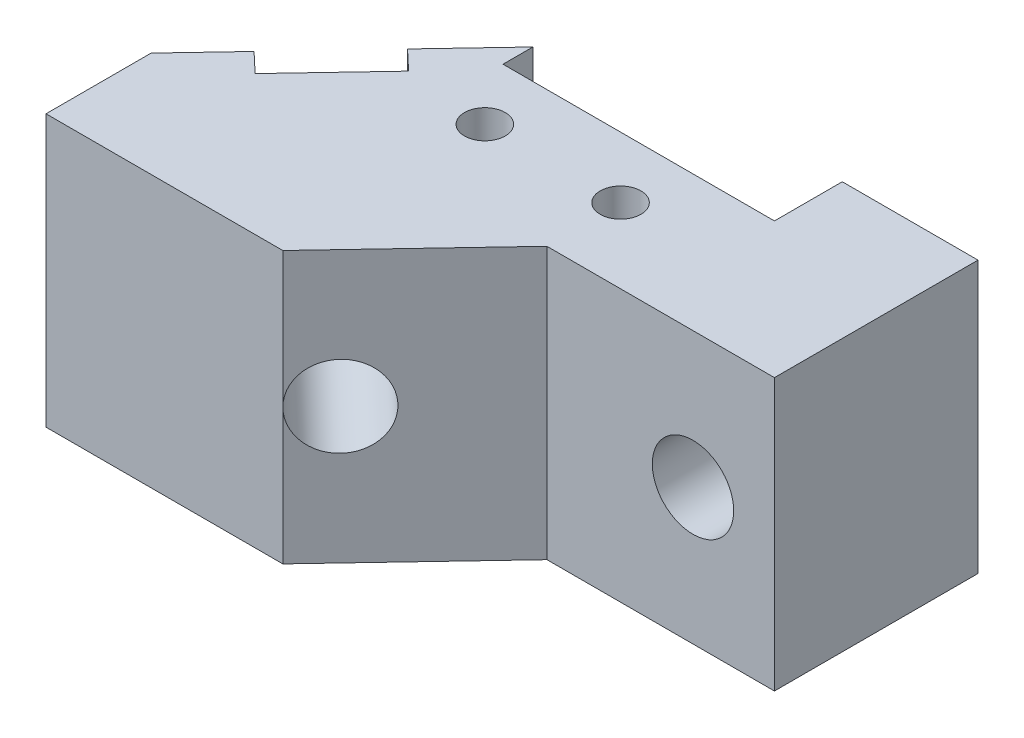
ISO-10303-21;
HEADER;
FILE_DESCRIPTION(('STEP AP214'),'2;1');
FILE_NAME('part.step','',(''),(''),'','','');
FILE_SCHEMA(('AUTOMOTIVE_DESIGN { 1 0 10303 214 1 1 1 1 }'));
ENDSEC;
DATA;
#1=APPLICATION_CONTEXT('core data for automotive mechanical design processes');
#2=APPLICATION_PROTOCOL_DEFINITION('international standard','automotive_design',2000,#1);
#3=PRODUCT_CONTEXT('',#1,'mechanical');
#4=PRODUCT('Part','Part','',(#3));
#5=PRODUCT_RELATED_PRODUCT_CATEGORY('part','',(#4));
#6=PRODUCT_DEFINITION_FORMATION('','',#4);
#7=PRODUCT_DEFINITION_CONTEXT('part definition',#1,'design');
#8=PRODUCT_DEFINITION('design','',#6,#7);
#9=PRODUCT_DEFINITION_SHAPE('','',#8);
#10=(LENGTH_UNIT() NAMED_UNIT(*) SI_UNIT(.MILLI.,.METRE.));
#11=(NAMED_UNIT(*) PLANE_ANGLE_UNIT() SI_UNIT($,.RADIAN.));
#12=(NAMED_UNIT(*) SI_UNIT($,.STERADIAN.) SOLID_ANGLE_UNIT());
#13=UNCERTAINTY_MEASURE_WITH_UNIT(LENGTH_MEASURE(1.E-05),#10,'distance_accuracy_value','');
#14=(GEOMETRIC_REPRESENTATION_CONTEXT(3) GLOBAL_UNCERTAINTY_ASSIGNED_CONTEXT((#13)) GLOBAL_UNIT_ASSIGNED_CONTEXT((#10,
#11,#12)) REPRESENTATION_CONTEXT('',''));
#15=CARTESIAN_POINT('',(0.,0.,0.));
#16=DIRECTION('',(0.,0.,1.));
#17=DIRECTION('',(1.,0.,0.));
#18=AXIS2_PLACEMENT_3D('',#15,#16,#17);
#19=CARTESIAN_POINT('',(-37.6748986965471,20.,-40.));
#20=DIRECTION('',(0.,0.,1.));
#21=DIRECTION('',(1.,0.,0.));
#22=AXIS2_PLACEMENT_3D('',#19,#20,#21);
#23=PLANE('',#22);
#24=CARTESIAN_POINT('',(0.,10.,-40.));
#25=DIRECTION('',(0.,0.,-1.));
#26=DIRECTION('',(-1.,0.,0.));
#27=AXIS2_PLACEMENT_3D('',#24,#25,#26);
#28=CIRCLE('',#27,3.);
#29=CARTESIAN_POINT('',(-3.,10.,-40.));
#30=VERTEX_POINT('',#29);
#31=EDGE_CURVE('E232',#30,#30,#28,.T.);
#32=ORIENTED_EDGE('',*,*,#31,.F.);
#33=EDGE_LOOP('',(#32));
#34=FACE_BOUND('',#33,.T.);
#35=DIRECTION('',(0.,1.,0.));
#36=VECTOR('',#35,1.);
#37=CARTESIAN_POINT('',(-4.,0.,-40.));
#38=LINE('',#37,#36);
#39=CARTESIAN_POINT('',(-4.,0.,-40.));
#40=VERTEX_POINT('',#39);
#41=CARTESIAN_POINT('',(-4.,20.,-40.));
#42=VERTEX_POINT('',#41);
#43=EDGE_CURVE('E408',#40,#42,#38,.T.);
#44=ORIENTED_EDGE('',*,*,#43,.T.);
#45=DIRECTION('',(-1.,0.,0.));
#46=VECTOR('',#45,1.);
#47=CARTESIAN_POINT('',(-37.6748986965471,20.,-40.));
#48=LINE('',#47,#46);
#49=CARTESIAN_POINT('',(6.,20.,-40.));
#50=VERTEX_POINT('',#49);
#51=EDGE_CURVE('E235',#50,#42,#48,.T.);
#52=ORIENTED_EDGE('',*,*,#51,.F.);
#53=DIRECTION('',(0.,-1.,0.));
#54=VECTOR('',#53,1.);
#55=CARTESIAN_POINT('',(6.,20.,-40.));
#56=LINE('',#55,#54);
#57=CARTESIAN_POINT('',(6.,0.,-40.));
#58=VERTEX_POINT('',#57);
#59=EDGE_CURVE('E246',#50,#58,#56,.T.);
#60=ORIENTED_EDGE('',*,*,#59,.T.);
#61=DIRECTION('',(-1.,0.,0.));
#62=VECTOR('',#61,1.);
#63=CARTESIAN_POINT('',(-37.6748986965471,0.,-40.));
#64=LINE('',#63,#62);
#65=EDGE_CURVE('E243',#58,#40,#64,.T.);
#66=ORIENTED_EDGE('',*,*,#65,.T.);
#67=EDGE_LOOP('',(#44,#52,#60,#66));
#68=FACE_BOUND('',#67,.T.);
#69=ADVANCED_FACE('F36',(#34,#68),#23,.F.);
#70=CARTESIAN_POINT('',(0.,20.,0.));
#71=DIRECTION('',(0.,1.,0.));
#72=DIRECTION('',(0.,0.,1.));
#73=AXIS2_PLACEMENT_3D('',#70,#71,#72);
#74=PLANE('',#73);
#75=CARTESIAN_POINT('',(-20.8374493482735,20.,-30.5));
#76=DIRECTION('',(0.,1.,0.));
#77=DIRECTION('',(0.,0.,-1.));
#78=AXIS2_PLACEMENT_3D('',#75,#76,#77);
#79=CIRCLE('',#78,1.5);
#80=CARTESIAN_POINT('',(-20.8374493482735,20.,-32.));
#81=VERTEX_POINT('',#80);
#82=EDGE_CURVE('E325',#81,#81,#79,.T.);
#83=ORIENTED_EDGE('',*,*,#82,.F.);
#84=EDGE_LOOP('',(#83));
#85=FACE_BOUND('',#84,.T.);
#86=CARTESIAN_POINT('',(-10.8374493482735,20.,-30.5));
#87=DIRECTION('',(0.,1.,0.));
#88=DIRECTION('',(0.,0.,1.));
#89=AXIS2_PLACEMENT_3D('',#86,#87,#88);
#90=CIRCLE('',#89,1.5);
#91=CARTESIAN_POINT('',(-10.8374493482735,20.,-29.));
#92=VERTEX_POINT('',#91);
#93=EDGE_CURVE('E318',#92,#92,#90,.T.);
#94=ORIENTED_EDGE('',*,*,#93,.F.);
#95=EDGE_LOOP('',(#94));
#96=FACE_BOUND('',#95,.T.);
#97=DIRECTION('',(0.687178620265699,0.,-0.726488502214405));
#98=VECTOR('',#97,1.);
#99=CARTESIAN_POINT('',(-24.,20.,-37.2017917800907));
#100=LINE('',#99,#98);
#101=CARTESIAN_POINT('',(-37.6748986965471,20.,-22.7446239069881));
#102=VERTEX_POINT('',#101);
#103=CARTESIAN_POINT('',(-33.9877200762813,20.,-26.6427266625688));
#104=VERTEX_POINT('',#103);
#105=EDGE_CURVE('E51',#102,#104,#100,.T.);
#106=ORIENTED_EDGE('',*,*,#105,.F.);
#107=DIRECTION('',(0.,0.,1.));
#108=VECTOR('',#107,1.);
#109=CARTESIAN_POINT('',(-37.6748986965471,20.,-40.));
#110=LINE('',#109,#108);
#111=CARTESIAN_POINT('',(-37.674898696547,20.,-15.));
#112=VERTEX_POINT('',#111);
#113=EDGE_CURVE('E219',#102,#112,#110,.T.);
#114=ORIENTED_EDGE('',*,*,#113,.T.);
#115=DIRECTION('',(1.,0.,0.));
#116=VECTOR('',#115,1.);
#117=CARTESIAN_POINT('',(-37.674898696547,20.,-15.));
#118=LINE('',#117,#116);
#119=CARTESIAN_POINT('',(-20.2237484161567,20.,-15.));
#120=VERTEX_POINT('',#119);
#121=EDGE_CURVE('E392',#112,#120,#118,.T.);
#122=ORIENTED_EDGE('',*,*,#121,.T.);
#123=DIRECTION('',(0.687178620265726,0.,-0.72648850221438));
#124=VECTOR('',#123,1.);
#125=CARTESIAN_POINT('',(-10.7648427600979,20.,-25.));
#126=LINE('',#125,#124);
#127=CARTESIAN_POINT('',(-10.7648427600979,20.,-25.));
#128=VERTEX_POINT('',#127);
#129=EDGE_CURVE('E394',#120,#128,#126,.T.);
#130=ORIENTED_EDGE('',*,*,#129,.T.);
#131=DIRECTION('',(1.,0.,0.));
#132=VECTOR('',#131,1.);
#133=CARTESIAN_POINT('',(6.,20.,-25.));
#134=LINE('',#133,#132);
#135=CARTESIAN_POINT('',(6.,20.,-25.));
#136=VERTEX_POINT('',#135);
#137=EDGE_CURVE('E396',#128,#136,#134,.T.);
#138=ORIENTED_EDGE('',*,*,#137,.T.);
#139=DIRECTION('',(0.,0.,-1.));
#140=VECTOR('',#139,1.);
#141=CARTESIAN_POINT('',(6.,20.,-40.));
#142=LINE('',#141,#140);
#143=EDGE_CURVE('E397',#136,#50,#142,.T.);
#144=ORIENTED_EDGE('',*,*,#143,.T.);
#145=ORIENTED_EDGE('',*,*,#51,.T.);
#146=DIRECTION('',(0.,0.,-1.));
#147=VECTOR('',#146,1.);
#148=CARTESIAN_POINT('',(-4.,20.,-35.));
#149=LINE('',#148,#147);
#150=CARTESIAN_POINT('',(-4.,20.,-35.));
#151=VERTEX_POINT('',#150);
#152=EDGE_CURVE('E404',#151,#42,#149,.T.);
#153=ORIENTED_EDGE('',*,*,#152,.F.);
#154=DIRECTION('',(1.,0.,0.));
#155=VECTOR('',#154,1.);
#156=CARTESIAN_POINT('',(0.,20.,-35.));
#157=LINE('',#156,#155);
#158=CARTESIAN_POINT('',(-24.,20.,-35.));
#159=VERTEX_POINT('',#158);
#160=EDGE_CURVE('E763',#159,#151,#157,.T.);
#161=ORIENTED_EDGE('',*,*,#160,.F.);
#162=DIRECTION('',(0.,0.,-1.));
#163=VECTOR('',#162,1.);
#164=CARTESIAN_POINT('',(-24.,20.,-35.));
#165=LINE('',#164,#163);
#166=CARTESIAN_POINT('',(-24.,20.,-37.2017917800907));
#167=VERTEX_POINT('',#166);
#168=EDGE_CURVE('E431',#159,#167,#165,.T.);
#169=ORIENTED_EDGE('',*,*,#168,.T.);
#170=CARTESIAN_POINT('',(-28.4902911141557,20.,-32.454634680284));
#171=VERTEX_POINT('',#170);
#172=EDGE_CURVE('E59',#171,#167,#100,.T.);
#173=ORIENTED_EDGE('',*,*,#172,.F.);
#174=DIRECTION('',(0.726488502214379,0.,0.687178620265727));
#175=VECTOR('',#174,1.);
#176=CARTESIAN_POINT('',(-37.1046470805999,20.,-40.6028727177143));
#177=LINE('',#176,#175);
#178=CARTESIAN_POINT('',(-27.0373141097267,20.,-31.0802774397523));
#179=VERTEX_POINT('',#178);
#180=EDGE_CURVE('E353',#171,#179,#177,.T.);
#181=ORIENTED_EDGE('',*,*,#180,.T.);
#182=DIRECTION('',(0.687178620265725,0.,-0.726488502214381));
#183=VECTOR('',#182,1.);
#184=CARTESIAN_POINT('',(-27.0373141097267,20.,-31.0802774397523));
#185=LINE('',#184,#183);
#186=CARTESIAN_POINT('',(-32.5347430718525,20.,-25.2683694220373));
#187=VERTEX_POINT('',#186);
#188=EDGE_CURVE('E351',#187,#179,#185,.T.);
#189=ORIENTED_EDGE('',*,*,#188,.F.);
#190=DIRECTION('',(0.726488502214379,0.,0.687178620265727));
#191=VECTOR('',#190,1.);
#192=CARTESIAN_POINT('',(-42.6020760427257,20.,-34.7909646999993));
#193=LINE('',#192,#191);
#194=EDGE_CURVE('E349',#104,#187,#193,.T.);
#195=ORIENTED_EDGE('',*,*,#194,.F.);
#196=EDGE_LOOP('',(#106,#114,#122,#130,#138,#144,#145,#153,#161,#169,#173,#181,#189,#195));
#197=FACE_BOUND('',#196,.T.);
#198=ADVANCED_FACE('F340',(#85,#96,#197),#74,.T.);
#199=CARTESIAN_POINT('',(-36.4174684603342,5.,-41.3293612199287));
#200=DIRECTION('',(0.687178620265726,0.,-0.726488502214379));
#201=DIRECTION('',(-0.72648850221438,0.,-0.687178620265727));
#202=AXIS2_PLACEMENT_3D('',#199,#200,#201);
#203=PLANE('',#202);
#204=DIRECTION('',(0.726488502214379,0.,0.687178620265726));
#205=VECTOR('',#204,1.);
#206=CARTESIAN_POINT('',(-36.4174684603342,15.,-41.3293612199287));
#207=LINE('',#206,#205);
#208=CARTESIAN_POINT('',(-27.80311249389,15.,-33.1811231824984));
#209=VERTEX_POINT('',#208);
#210=CARTESIAN_POINT('',(-24.1706699828178,15.,-29.7452300811695));
#211=VERTEX_POINT('',#210);
#212=EDGE_CURVE('E383',#209,#211,#207,.T.);
#213=ORIENTED_EDGE('',*,*,#212,.F.);
#214=DIRECTION('',(0.,-1.,0.));
#215=VECTOR('',#214,1.);
#216=CARTESIAN_POINT('',(-27.80311249389,5.,-33.1811231824985));
#217=LINE('',#216,#215);
#218=CARTESIAN_POINT('',(-27.80311249389,5.,-33.1811231824985));
#219=VERTEX_POINT('',#218);
#220=EDGE_CURVE('E301',#209,#219,#217,.T.);
#221=ORIENTED_EDGE('',*,*,#220,.T.);
#222=DIRECTION('',(0.726488502214379,0.,0.687178620265726));
#223=VECTOR('',#222,1.);
#224=CARTESIAN_POINT('',(-36.4174684603342,5.,-41.3293612199287));
#225=LINE('',#224,#223);
#226=CARTESIAN_POINT('',(-24.1706699828178,5.,-29.7452300811695));
#227=VERTEX_POINT('',#226);
#228=EDGE_CURVE('E385',#219,#227,#225,.T.);
#229=ORIENTED_EDGE('',*,*,#228,.T.);
#230=DIRECTION('',(0.,1.,0.));
#231=VECTOR('',#230,1.);
#232=CARTESIAN_POINT('',(-24.1706699828178,5.,-29.7452300811695));
#233=LINE('',#232,#231);
#234=EDGE_CURVE('E375',#227,#211,#233,.T.);
#235=ORIENTED_EDGE('',*,*,#234,.T.);
#236=EDGE_LOOP('',(#213,#221,#229,#235));
#237=FACE_BOUND('',#236,.T.);
#238=ADVANCED_FACE('F343',(#237),#203,.F.);
#239=CARTESIAN_POINT('',(-37.6748986965471,20.,-40.));
#240=DIRECTION('',(1.,0.,0.));
#241=DIRECTION('',(0.,0.,-1.));
#242=AXIS2_PLACEMENT_3D('',#239,#240,#241);
#243=PLANE('',#242);
#244=ORIENTED_EDGE('',*,*,#113,.F.);
#245=DIRECTION('',(0.,1.,0.));
#246=VECTOR('',#245,1.);
#247=CARTESIAN_POINT('',(-37.6748986965471,0.,-22.7446239069881));
#248=LINE('',#247,#246);
#249=CARTESIAN_POINT('',(-37.6748986965471,0.,-22.7446239069881));
#250=VERTEX_POINT('',#249);
#251=EDGE_CURVE('E206',#250,#102,#248,.T.);
#252=ORIENTED_EDGE('',*,*,#251,.F.);
#253=DIRECTION('',(0.,0.,1.));
#254=VECTOR('',#253,1.);
#255=CARTESIAN_POINT('',(-37.6748986965471,0.,-40.));
#256=LINE('',#255,#254);
#257=CARTESIAN_POINT('',(-37.674898696547,0.,-15.));
#258=VERTEX_POINT('',#257);
#259=EDGE_CURVE('E217',#250,#258,#256,.T.);
#260=ORIENTED_EDGE('',*,*,#259,.T.);
#261=DIRECTION('',(0.,-1.,0.));
#262=VECTOR('',#261,1.);
#263=CARTESIAN_POINT('',(-37.674898696547,20.,-15.));
#264=LINE('',#263,#262);
#265=EDGE_CURVE('E259',#112,#258,#264,.T.);
#266=ORIENTED_EDGE('',*,*,#265,.F.);
#267=EDGE_LOOP('',(#244,#252,#260,#266));
#268=FACE_BOUND('',#267,.T.);
#269=ADVANCED_FACE('F38',(#268),#243,.F.);
#270=CARTESIAN_POINT('',(0.,0.,0.));
#271=DIRECTION('',(0.,1.,0.));
#272=DIRECTION('',(0.,0.,1.));
#273=AXIS2_PLACEMENT_3D('',#270,#271,#272);
#274=PLANE('',#273);
#275=CARTESIAN_POINT('',(-20.8374493482735,0.,-30.5));
#276=DIRECTION('',(0.,1.,0.));
#277=DIRECTION('',(0.,0.,-1.));
#278=AXIS2_PLACEMENT_3D('',#275,#276,#277);
#279=CIRCLE('',#278,1.5);
#280=CARTESIAN_POINT('',(-20.8374493482735,0.,-32.));
#281=VERTEX_POINT('',#280);
#282=EDGE_CURVE('E322',#281,#281,#279,.T.);
#283=ORIENTED_EDGE('',*,*,#282,.T.);
#284=EDGE_LOOP('',(#283));
#285=FACE_BOUND('',#284,.T.);
#286=CARTESIAN_POINT('',(-10.8374493482735,0.,-30.5));
#287=DIRECTION('',(0.,1.,0.));
#288=DIRECTION('',(0.,0.,1.));
#289=AXIS2_PLACEMENT_3D('',#286,#287,#288);
#290=CIRCLE('',#289,1.5);
#291=CARTESIAN_POINT('',(-10.8374493482735,0.,-29.));
#292=VERTEX_POINT('',#291);
#293=EDGE_CURVE('E321',#292,#292,#290,.T.);
#294=ORIENTED_EDGE('',*,*,#293,.T.);
#295=EDGE_LOOP('',(#294));
#296=FACE_BOUND('',#295,.T.);
#297=ORIENTED_EDGE('',*,*,#259,.F.);
#298=DIRECTION('',(0.687178620265699,0.,-0.726488502214405));
#299=VECTOR('',#298,1.);
#300=CARTESIAN_POINT('',(-24.,0.,-37.2017917800907));
#301=LINE('',#300,#299);
#302=CARTESIAN_POINT('',(-33.9877200762813,0.,-26.6427266625688));
#303=VERTEX_POINT('',#302);
#304=EDGE_CURVE('E203',#250,#303,#301,.T.);
#305=ORIENTED_EDGE('',*,*,#304,.T.);
#306=DIRECTION('',(0.726488502214379,0.,0.687178620265727));
#307=VECTOR('',#306,1.);
#308=CARTESIAN_POINT('',(-42.6020760427257,0.,-34.7909646999993));
#309=LINE('',#308,#307);
#310=CARTESIAN_POINT('',(-32.5347430718525,0.,-25.2683694220373));
#311=VERTEX_POINT('',#310);
#312=EDGE_CURVE('E352',#303,#311,#309,.T.);
#313=ORIENTED_EDGE('',*,*,#312,.T.);
#314=DIRECTION('',(-0.687178620265727,0.,0.726488502214379));
#315=VECTOR('',#314,1.);
#316=CARTESIAN_POINT('',(-27.6075657256738,0.,-30.477404722038));
#317=LINE('',#316,#315);
#318=CARTESIAN_POINT('',(-27.0373141097267,0.,-31.0802774397523));
#319=VERTEX_POINT('',#318);
#320=EDGE_CURVE('E439',#319,#311,#317,.T.);
#321=ORIENTED_EDGE('',*,*,#320,.F.);
#322=DIRECTION('',(0.726488502214379,0.,0.687178620265727));
#323=VECTOR('',#322,1.);
#324=CARTESIAN_POINT('',(-37.1046470805999,0.,-40.6028727177143));
#325=LINE('',#324,#323);
#326=CARTESIAN_POINT('',(-28.4902911141557,0.,-32.454634680284));
#327=VERTEX_POINT('',#326);
#328=EDGE_CURVE('E355',#327,#319,#325,.T.);
#329=ORIENTED_EDGE('',*,*,#328,.F.);
#330=CARTESIAN_POINT('',(-24.,0.,-37.2017917800907));
#331=VERTEX_POINT('',#330);
#332=EDGE_CURVE('E212',#327,#331,#301,.T.);
#333=ORIENTED_EDGE('',*,*,#332,.T.);
#334=DIRECTION('',(0.,0.,-1.));
#335=VECTOR('',#334,1.);
#336=CARTESIAN_POINT('',(-24.,0.,-35.));
#337=LINE('',#336,#335);
#338=CARTESIAN_POINT('',(-24.,0.,-35.));
#339=VERTEX_POINT('',#338);
#340=EDGE_CURVE('E425',#339,#331,#337,.T.);
#341=ORIENTED_EDGE('',*,*,#340,.F.);
#342=DIRECTION('',(-1.,0.,0.));
#343=VECTOR('',#342,1.);
#344=CARTESIAN_POINT('',(0.,0.,-35.));
#345=LINE('',#344,#343);
#346=CARTESIAN_POINT('',(-4.,0.,-35.));
#347=VERTEX_POINT('',#346);
#348=EDGE_CURVE('E757',#347,#339,#345,.T.);
#349=ORIENTED_EDGE('',*,*,#348,.F.);
#350=DIRECTION('',(0.,0.,-1.));
#351=VECTOR('',#350,1.);
#352=CARTESIAN_POINT('',(-4.,0.,-35.));
#353=LINE('',#352,#351);
#354=EDGE_CURVE('E428',#347,#40,#353,.T.);
#355=ORIENTED_EDGE('',*,*,#354,.T.);
#356=ORIENTED_EDGE('',*,*,#65,.F.);
#357=DIRECTION('',(0.,0.,-1.));
#358=VECTOR('',#357,1.);
#359=CARTESIAN_POINT('',(6.,0.,-40.));
#360=LINE('',#359,#358);
#361=CARTESIAN_POINT('',(6.,0.,-25.));
#362=VERTEX_POINT('',#361);
#363=EDGE_CURVE('E241',#362,#58,#360,.T.);
#364=ORIENTED_EDGE('',*,*,#363,.F.);
#365=DIRECTION('',(1.,0.,0.));
#366=VECTOR('',#365,1.);
#367=CARTESIAN_POINT('',(6.,0.,-25.));
#368=LINE('',#367,#366);
#369=CARTESIAN_POINT('',(-10.7648427600979,0.,-25.));
#370=VERTEX_POINT('',#369);
#371=EDGE_CURVE('E239',#370,#362,#368,.T.);
#372=ORIENTED_EDGE('',*,*,#371,.F.);
#373=DIRECTION('',(0.687178620265726,0.,-0.72648850221438));
#374=VECTOR('',#373,1.);
#375=CARTESIAN_POINT('',(-10.7648427600979,0.,-25.));
#376=LINE('',#375,#374);
#377=CARTESIAN_POINT('',(-20.2237484161567,0.,-15.));
#378=VERTEX_POINT('',#377);
#379=EDGE_CURVE('E229',#378,#370,#376,.T.);
#380=ORIENTED_EDGE('',*,*,#379,.F.);
#381=DIRECTION('',(1.,0.,0.));
#382=VECTOR('',#381,1.);
#383=CARTESIAN_POINT('',(-37.674898696547,0.,-15.));
#384=LINE('',#383,#382);
#385=EDGE_CURVE('E225',#258,#378,#384,.T.);
#386=ORIENTED_EDGE('',*,*,#385,.F.);
#387=EDGE_LOOP('',(#297,#305,#313,#321,#329,#333,#341,#349,#355,#356,#364,#372,#380,#386));
#388=FACE_BOUND('',#387,.T.);
#389=ADVANCED_FACE('F222',(#285,#296,#388),#274,.F.);
#390=CARTESIAN_POINT('',(-27.6065630841464,10.,-26.1127875700976));
#391=DIRECTION('',(0.726488502214379,0.,0.687178620265727));
#392=DIRECTION('',(0.687178620265727,0.,-0.726488502214379));
#393=AXIS2_PLACEMENT_3D('',#390,#391,#392);
#394=CYLINDRICAL_SURFACE('',#393,3.);
#395=CARTESIAN_POINT('',(-18.1622125553595,10.,-17.1794655066432));
#396=DIRECTION('',(0.726488502214379,0.,0.687178620265727));
#397=DIRECTION('',(0.687178620265727,0.,-0.726488502214379));
#398=AXIS2_PLACEMENT_3D('',#395,#396,#397);
#399=CIRCLE('',#398,3.);
#400=CARTESIAN_POINT('',(-20.2237484161567,10.,-15.));
#401=VERTEX_POINT('',#400);
#402=EDGE_CURVE('E382',#401,#401,#399,.T.);
#403=ORIENTED_EDGE('',*,*,#402,.T.);
#404=EDGE_LOOP('',(#403));
#405=FACE_BOUND('',#404,.T.);
#406=CARTESIAN_POINT('',(-25.4270975775033,10.,-24.0512517093005));
#407=DIRECTION('',(-0.726488502214379,0.,-0.687178620265727));
#408=DIRECTION('',(-0.687178620265727,0.,0.726488502214379));
#409=AXIS2_PLACEMENT_3D('',#406,#407,#408);
#410=CIRCLE('',#409,3.);
#411=CARTESIAN_POINT('',(-27.4886334383005,10.,-21.8717862026573));
#412=VERTEX_POINT('',#411);
#413=EDGE_CURVE('E261',#412,#412,#410,.F.);
#414=ORIENTED_EDGE('',*,*,#413,.F.);
#415=EDGE_LOOP('',(#414));
#416=FACE_BOUND('',#415,.T.);
#417=ADVANCED_FACE('F493',(#405,#416),#394,.F.);
#418=CARTESIAN_POINT('',(-37.674898696547,20.,-15.));
#419=DIRECTION('',(0.,0.,-1.));
#420=DIRECTION('',(-1.,0.,0.));
#421=AXIS2_PLACEMENT_3D('',#418,#419,#420);
#422=PLANE('',#421);
#423=ORIENTED_EDGE('',*,*,#385,.T.);
#424=DIRECTION('',(0.,-1.,0.));
#425=VECTOR('',#424,1.);
#426=CARTESIAN_POINT('',(-20.2237484161567,20.,-15.));
#427=LINE('',#426,#425);
#428=EDGE_CURVE('E255',#401,#378,#427,.T.);
#429=ORIENTED_EDGE('',*,*,#428,.F.);
#430=EDGE_CURVE('E256',#120,#401,#427,.T.);
#431=ORIENTED_EDGE('',*,*,#430,.F.);
#432=ORIENTED_EDGE('',*,*,#121,.F.);
#433=ORIENTED_EDGE('',*,*,#265,.T.);
#434=EDGE_LOOP('',(#423,#429,#431,#432,#433));
#435=FACE_BOUND('',#434,.T.);
#436=ADVANCED_FACE('F490',(#435),#422,.F.);
#437=CARTESIAN_POINT('',(-10.7648427600979,20.,-25.));
#438=DIRECTION('',(-0.72648850221438,0.,-0.687178620265726));
#439=DIRECTION('',(-0.687178620265726,0.,0.72648850221438));
#440=AXIS2_PLACEMENT_3D('',#437,#438,#439);
#441=PLANE('',#440);
#442=ORIENTED_EDGE('',*,*,#430,.T.);
#443=ORIENTED_EDGE('',*,*,#402,.F.);
#444=ORIENTED_EDGE('',*,*,#428,.T.);
#445=ORIENTED_EDGE('',*,*,#379,.T.);
#446=DIRECTION('',(0.,-1.,0.));
#447=VECTOR('',#446,1.);
#448=CARTESIAN_POINT('',(-10.7648427600979,20.,-25.));
#449=LINE('',#448,#447);
#450=EDGE_CURVE('E252',#128,#370,#449,.T.);
#451=ORIENTED_EDGE('',*,*,#450,.F.);
#452=ORIENTED_EDGE('',*,*,#129,.F.);
#453=EDGE_LOOP('',(#442,#443,#444,#445,#451,#452));
#454=FACE_BOUND('',#453,.T.);
#455=ADVANCED_FACE('F487',(#454),#441,.F.);
#456=CARTESIAN_POINT('',(6.,20.,-25.));
#457=DIRECTION('',(0.,0.,-1.));
#458=DIRECTION('',(-1.,0.,0.));
#459=AXIS2_PLACEMENT_3D('',#456,#457,#458);
#460=PLANE('',#459);
#461=CARTESIAN_POINT('',(0.,10.,-25.));
#462=DIRECTION('',(0.,0.,-1.));
#463=DIRECTION('',(-1.,0.,0.));
#464=AXIS2_PLACEMENT_3D('',#461,#462,#463);
#465=CIRCLE('',#464,3.);
#466=CARTESIAN_POINT('',(-3.,10.,-25.));
#467=VERTEX_POINT('',#466);
#468=EDGE_CURVE('E227',#467,#467,#465,.T.);
#469=ORIENTED_EDGE('',*,*,#468,.T.);
#470=EDGE_LOOP('',(#469));
#471=FACE_BOUND('',#470,.T.);
#472=ORIENTED_EDGE('',*,*,#371,.T.);
#473=DIRECTION('',(0.,-1.,0.));
#474=VECTOR('',#473,1.);
#475=CARTESIAN_POINT('',(6.,20.,-25.));
#476=LINE('',#475,#474);
#477=EDGE_CURVE('E249',#136,#362,#476,.T.);
#478=ORIENTED_EDGE('',*,*,#477,.F.);
#479=ORIENTED_EDGE('',*,*,#137,.F.);
#480=ORIENTED_EDGE('',*,*,#450,.T.);
#481=EDGE_LOOP('',(#472,#478,#479,#480));
#482=FACE_BOUND('',#481,.T.);
#483=ADVANCED_FACE('F483',(#471,#482),#460,.F.);
#484=CARTESIAN_POINT('',(6.,20.,-40.));
#485=DIRECTION('',(-1.,0.,0.));
#486=DIRECTION('',(0.,0.,1.));
#487=AXIS2_PLACEMENT_3D('',#484,#485,#486);
#488=PLANE('',#487);
#489=ORIENTED_EDGE('',*,*,#363,.T.);
#490=ORIENTED_EDGE('',*,*,#59,.F.);
#491=ORIENTED_EDGE('',*,*,#143,.F.);
#492=ORIENTED_EDGE('',*,*,#477,.T.);
#493=EDGE_LOOP('',(#489,#490,#491,#492));
#494=FACE_BOUND('',#493,.T.);
#495=ADVANCED_FACE('F479',(#494),#488,.F.);
#496=CARTESIAN_POINT('',(0.,10.,-15.));
#497=DIRECTION('',(0.,0.,-1.));
#498=DIRECTION('',(-1.,0.,0.));
#499=AXIS2_PLACEMENT_3D('',#496,#497,#498);
#500=CYLINDRICAL_SURFACE('',#499,3.);
#501=ORIENTED_EDGE('',*,*,#31,.T.);
#502=EDGE_LOOP('',(#501));
#503=FACE_BOUND('',#502,.T.);
#504=ORIENTED_EDGE('',*,*,#468,.F.);
#505=EDGE_LOOP('',(#504));
#506=FACE_BOUND('',#505,.T.);
#507=ADVANCED_FACE('F482',(#503,#506),#500,.F.);
#508=CARTESIAN_POINT('',(-43.2892546629915,5.,-34.0644761977849));
#509=DIRECTION('',(-0.687178620265726,0.,0.726488502214379));
#510=DIRECTION('',(0.72648850221438,0.,0.687178620265727));
#511=AXIS2_PLACEMENT_3D('',#508,#509,#510);
#512=PLANE('',#511);
#513=DIRECTION('',(0.726488502214379,0.,0.687178620265726));
#514=VECTOR('',#513,1.);
#515=CARTESIAN_POINT('',(-43.2892546629915,5.,-34.0644761977849));
#516=LINE('',#515,#514);
#517=CARTESIAN_POINT('',(-34.674898696547,5.,-25.9162381603544));
#518=VERTEX_POINT('',#517);
#519=CARTESIAN_POINT('',(-31.0424561854751,5.,-22.4803450590257));
#520=VERTEX_POINT('',#519);
#521=EDGE_CURVE('E380',#518,#520,#516,.T.);
#522=ORIENTED_EDGE('',*,*,#521,.F.);
#523=DIRECTION('',(0.,1.,0.));
#524=VECTOR('',#523,1.);
#525=CARTESIAN_POINT('',(-34.674898696547,5.,-25.9162381603544));
#526=LINE('',#525,#524);
#527=CARTESIAN_POINT('',(-34.674898696547,15.,-25.9162381603544));
#528=VERTEX_POINT('',#527);
#529=EDGE_CURVE('E291',#518,#528,#526,.T.);
#530=ORIENTED_EDGE('',*,*,#529,.T.);
#531=DIRECTION('',(0.726488502214379,0.,0.687178620265726));
#532=VECTOR('',#531,1.);
#533=CARTESIAN_POINT('',(-43.2892546629915,15.,-34.0644761977849));
#534=LINE('',#533,#532);
#535=CARTESIAN_POINT('',(-31.0424561854751,15.,-22.4803450590257));
#536=VERTEX_POINT('',#535);
#537=EDGE_CURVE('E289',#528,#536,#534,.T.);
#538=ORIENTED_EDGE('',*,*,#537,.T.);
#539=DIRECTION('',(0.,-1.,0.));
#540=VECTOR('',#539,1.);
#541=CARTESIAN_POINT('',(-31.0424561854751,5.,-22.4803450590257));
#542=LINE('',#541,#540);
#543=EDGE_CURVE('E367',#536,#520,#542,.T.);
#544=ORIENTED_EDGE('',*,*,#543,.T.);
#545=EDGE_LOOP('',(#522,#530,#538,#544));
#546=FACE_BOUND('',#545,.T.);
#547=ADVANCED_FACE('F531',(#546),#512,.F.);
#548=CARTESIAN_POINT('',(-36.4174684603342,15.,-41.3293612199287));
#549=DIRECTION('',(0.,1.,0.));
#550=DIRECTION('',(0.,0.,1.));
#551=AXIS2_PLACEMENT_3D('',#548,#549,#550);
#552=PLANE('',#551);
#553=ORIENTED_EDGE('',*,*,#537,.F.);
#554=DIRECTION('',(0.687178620265699,0.,-0.726488502214405));
#555=VECTOR('',#554,1.);
#556=CARTESIAN_POINT('',(-27.8031124938897,15.,-33.1811231824988));
#557=LINE('',#556,#555);
#558=CARTESIAN_POINT('',(-33.9877200762813,15.,-26.6427266625688));
#559=VERTEX_POINT('',#558);
#560=EDGE_CURVE('E287',#528,#559,#557,.T.);
#561=ORIENTED_EDGE('',*,*,#560,.T.);
#562=DIRECTION('',(-0.726488502214379,0.,-0.687178620265727));
#563=VECTOR('',#562,1.);
#564=CARTESIAN_POINT('',(-42.6020760427257,15.,-34.7909646999993));
#565=LINE('',#564,#563);
#566=CARTESIAN_POINT('',(-32.5347430718525,15.,-25.2683694220373));
#567=VERTEX_POINT('',#566);
#568=EDGE_CURVE('E44',#567,#559,#565,.T.);
#569=ORIENTED_EDGE('',*,*,#568,.F.);
#570=DIRECTION('',(0.687178620265726,0.,-0.72648850221438));
#571=VECTOR('',#570,1.);
#572=CARTESIAN_POINT('',(-26.3501354894609,15.,-31.8067659419667));
#573=LINE('',#572,#571);
#574=CARTESIAN_POINT('',(-27.0373141097267,15.,-31.0802774397523));
#575=VERTEX_POINT('',#574);
#576=EDGE_CURVE('E286',#567,#575,#573,.T.);
#577=ORIENTED_EDGE('',*,*,#576,.T.);
#578=DIRECTION('',(0.726488502214379,0.,0.687178620265727));
#579=VECTOR('',#578,1.);
#580=CARTESIAN_POINT('',(-37.1046470805999,15.,-40.6028727177143));
#581=LINE('',#580,#579);
#582=CARTESIAN_POINT('',(-28.4902911141557,15.,-32.454634680284));
#583=VERTEX_POINT('',#582);
#584=EDGE_CURVE('E357',#583,#575,#581,.T.);
#585=ORIENTED_EDGE('',*,*,#584,.F.);
#586=EDGE_CURVE('E293',#583,#209,#557,.T.);
#587=ORIENTED_EDGE('',*,*,#586,.T.);
#588=ORIENTED_EDGE('',*,*,#212,.T.);
#589=DIRECTION('',(-0.687178620265727,0.,0.726488502214379));
#590=VECTOR('',#589,1.);
#591=CARTESIAN_POINT('',(-24.1706699828178,15.,-29.7452300811695));
#592=LINE('',#591,#590);
#593=EDGE_CURVE('E378',#211,#536,#592,.T.);
#594=ORIENTED_EDGE('',*,*,#593,.T.);
#595=EDGE_LOOP('',(#553,#561,#569,#577,#585,#587,#588,#594));
#596=FACE_BOUND('',#595,.T.);
#597=ADVANCED_FACE('F284',(#596),#552,.F.);
#598=CARTESIAN_POINT('',(-36.4174684603342,5.,-41.3293612199287));
#599=DIRECTION('',(0.,-1.,0.));
#600=DIRECTION('',(0.,0.,-1.));
#601=AXIS2_PLACEMENT_3D('',#598,#599,#600);
#602=PLANE('',#601);
#603=ORIENTED_EDGE('',*,*,#228,.F.);
#604=DIRECTION('',(-0.687178620265699,0.,0.726488502214405));
#605=VECTOR('',#604,1.);
#606=CARTESIAN_POINT('',(-27.8031124938897,5.,-33.1811231824988));
#607=LINE('',#606,#605);
#608=CARTESIAN_POINT('',(-28.4902911141557,5.,-32.454634680284));
#609=VERTEX_POINT('',#608);
#610=EDGE_CURVE('E305',#219,#609,#607,.T.);
#611=ORIENTED_EDGE('',*,*,#610,.T.);
#612=DIRECTION('',(-0.726488502214379,0.,-0.687178620265727));
#613=VECTOR('',#612,1.);
#614=CARTESIAN_POINT('',(-37.1046470805999,5.,-40.6028727177143));
#615=LINE('',#614,#613);
#616=CARTESIAN_POINT('',(-27.0373141097267,5.,-31.0802774397523));
#617=VERTEX_POINT('',#616);
#618=EDGE_CURVE('E269',#617,#609,#615,.T.);
#619=ORIENTED_EDGE('',*,*,#618,.F.);
#620=DIRECTION('',(-0.687178620265726,0.,0.72648850221438));
#621=VECTOR('',#620,1.);
#622=CARTESIAN_POINT('',(-26.3501354894609,5.,-31.8067659419667));
#623=LINE('',#622,#621);
#624=CARTESIAN_POINT('',(-32.5347430718525,5.,-25.2683694220373));
#625=VERTEX_POINT('',#624);
#626=EDGE_CURVE('E264',#617,#625,#623,.T.);
#627=ORIENTED_EDGE('',*,*,#626,.T.);
#628=DIRECTION('',(0.726488502214379,0.,0.687178620265727));
#629=VECTOR('',#628,1.);
#630=CARTESIAN_POINT('',(-42.6020760427257,5.,-34.7909646999993));
#631=LINE('',#630,#629);
#632=CARTESIAN_POINT('',(-33.9877200762813,5.,-26.6427266625688));
#633=VERTEX_POINT('',#632);
#634=EDGE_CURVE('E267',#633,#625,#631,.T.);
#635=ORIENTED_EDGE('',*,*,#634,.F.);
#636=EDGE_CURVE('E294',#633,#518,#607,.T.);
#637=ORIENTED_EDGE('',*,*,#636,.T.);
#638=ORIENTED_EDGE('',*,*,#521,.T.);
#639=DIRECTION('',(0.687178620265727,0.,-0.726488502214379));
#640=VECTOR('',#639,1.);
#641=CARTESIAN_POINT('',(-24.1706699828178,5.,-29.7452300811695));
#642=LINE('',#641,#640);
#643=EDGE_CURVE('E372',#520,#227,#642,.T.);
#644=ORIENTED_EDGE('',*,*,#643,.T.);
#645=EDGE_LOOP('',(#603,#611,#619,#627,#635,#637,#638,#644));
#646=FACE_BOUND('',#645,.T.);
#647=ADVANCED_FACE('F524',(#646),#602,.F.);
#648=CARTESIAN_POINT('',(-27.6065630841464,0.,-26.1127875700976));
#649=DIRECTION('',(0.726488502214379,0.,0.687178620265727));
#650=DIRECTION('',(0.687178620265727,0.,-0.726488502214379));
#651=AXIS2_PLACEMENT_3D('',#648,#649,#650);
#652=PLANE('',#651);
#653=ORIENTED_EDGE('',*,*,#543,.F.);
#654=ORIENTED_EDGE('',*,*,#593,.F.);
#655=ORIENTED_EDGE('',*,*,#234,.F.);
#656=ORIENTED_EDGE('',*,*,#643,.F.);
#657=EDGE_LOOP('',(#653,#654,#655,#656));
#658=FACE_BOUND('',#657,.T.);
#659=CARTESIAN_POINT('',(-27.6065630841464,10.,-26.1127875700976));
#660=DIRECTION('',(-0.726488502214379,0.,-0.687178620265727));
#661=DIRECTION('',(-0.687178620265727,0.,0.726488502214379));
#662=AXIS2_PLACEMENT_3D('',#659,#660,#661);
#663=CIRCLE('',#662,0.999999999999999);
#664=CARTESIAN_POINT('',(-28.2937417044122,10.,-25.3862990678833));
#665=VERTEX_POINT('',#664);
#666=EDGE_CURVE('E363',#665,#665,#663,.T.);
#667=ORIENTED_EDGE('',*,*,#666,.F.);
#668=EDGE_LOOP('',(#667));
#669=FACE_BOUND('',#668,.T.);
#670=ADVANCED_FACE('F515',(#658,#669),#652,.F.);
#671=CARTESIAN_POINT('',(-25.4270975775033,10.,-24.0512517093004));
#672=DIRECTION('',(-0.726488502214379,0.,-0.687178620265727));
#673=DIRECTION('',(-0.687178620265727,0.,0.726488502214379));
#674=AXIS2_PLACEMENT_3D('',#671,#672,#673);
#675=PLANE('',#674);
#676=CARTESIAN_POINT('',(-25.4270975775033,10.,-24.0512517093004));
#677=DIRECTION('',(-0.726488502214379,0.,-0.687178620265727));
#678=DIRECTION('',(-0.687178620265727,0.,0.726488502214379));
#679=AXIS2_PLACEMENT_3D('',#676,#677,#678);
#680=CIRCLE('',#679,0.999999999999999);
#681=CARTESIAN_POINT('',(-26.114276197769,10.,-23.3247632070861));
#682=VERTEX_POINT('',#681);
#683=EDGE_CURVE('E364',#682,#682,#680,.T.);
#684=ORIENTED_EDGE('',*,*,#683,.T.);
#685=EDGE_LOOP('',(#684));
#686=FACE_BOUND('',#685,.T.);
#687=ORIENTED_EDGE('',*,*,#413,.T.);
#688=EDGE_LOOP('',(#687));
#689=FACE_BOUND('',#688,.T.);
#690=ADVANCED_FACE('F513',(#686,#689),#675,.F.);
#691=CARTESIAN_POINT('',(-25.4270975775033,10.,-24.0512517093004));
#692=DIRECTION('',(-0.726488502214379,0.,-0.687178620265727));
#693=DIRECTION('',(-0.687178620265727,0.,0.726488502214379));
#694=AXIS2_PLACEMENT_3D('',#691,#692,#693);
#695=CYLINDRICAL_SURFACE('',#694,0.999999999999999);
#696=ORIENTED_EDGE('',*,*,#683,.F.);
#697=EDGE_LOOP('',(#696));
#698=FACE_BOUND('',#697,.T.);
#699=ORIENTED_EDGE('',*,*,#666,.T.);
#700=EDGE_LOOP('',(#699));
#701=FACE_BOUND('',#700,.T.);
#702=ADVANCED_FACE('F469',(#698,#701),#695,.F.);
#703=CARTESIAN_POINT('',(-29.7860285907896,0.,-28.1743234308948));
#704=DIRECTION('',(0.72648850221438,0.,0.687178620265726));
#705=DIRECTION('',(0.687178620265726,0.,-0.72648850221438));
#706=AXIS2_PLACEMENT_3D('',#703,#704,#705);
#707=PLANE('',#706);
#708=DIRECTION('',(0.,-1.,0.));
#709=VECTOR('',#708,1.);
#710=CARTESIAN_POINT('',(-27.0373141097267,5.,-31.0802774397523));
#711=LINE('',#710,#709);
#712=EDGE_CURVE('E424',#617,#319,#711,.T.);
#713=ORIENTED_EDGE('',*,*,#712,.T.);
#714=ORIENTED_EDGE('',*,*,#320,.T.);
#715=DIRECTION('',(0.,1.,0.));
#716=VECTOR('',#715,1.);
#717=CARTESIAN_POINT('',(-32.5347430718525,5.,-25.2683694220373));
#718=LINE('',#717,#716);
#719=EDGE_CURVE('E442',#311,#625,#718,.T.);
#720=ORIENTED_EDGE('',*,*,#719,.T.);
#721=ORIENTED_EDGE('',*,*,#626,.F.);
#722=EDGE_LOOP('',(#713,#714,#720,#721));
#723=FACE_BOUND('',#722,.T.);
#724=ADVANCED_FACE('F458',(#723),#707,.F.);
#725=CARTESIAN_POINT('',(-42.6020760427257,5.,-34.7909646999993));
#726=DIRECTION('',(0.687178620265727,0.,-0.726488502214379));
#727=DIRECTION('',(-0.726488502214379,0.,-0.687178620265727));
#728=AXIS2_PLACEMENT_3D('',#725,#726,#727);
#729=PLANE('',#728);
#730=DIRECTION('',(0.,-1.,0.));
#731=VECTOR('',#730,1.);
#732=CARTESIAN_POINT('',(-33.9877200762813,5.,-26.6427266625688));
#733=LINE('',#732,#731);
#734=EDGE_CURVE('E208',#633,#303,#733,.T.);
#735=ORIENTED_EDGE('',*,*,#734,.F.);
#736=ORIENTED_EDGE('',*,*,#634,.T.);
#737=ORIENTED_EDGE('',*,*,#719,.F.);
#738=ORIENTED_EDGE('',*,*,#312,.F.);
#739=EDGE_LOOP('',(#735,#736,#737,#738));
#740=FACE_BOUND('',#739,.T.);
#741=ADVANCED_FACE('F468',(#740),#729,.T.);
#742=CARTESIAN_POINT('',(-37.1046470805999,5.,-40.6028727177143));
#743=DIRECTION('',(-0.687178620265727,0.,0.726488502214379));
#744=DIRECTION('',(0.726488502214379,0.,0.687178620265727));
#745=AXIS2_PLACEMENT_3D('',#742,#743,#744);
#746=PLANE('',#745);
#747=DIRECTION('',(0.,1.,0.));
#748=VECTOR('',#747,1.);
#749=CARTESIAN_POINT('',(-28.4902911141557,5.,-32.454634680284));
#750=LINE('',#749,#748);
#751=EDGE_CURVE('E296',#327,#609,#750,.T.);
#752=ORIENTED_EDGE('',*,*,#751,.F.);
#753=ORIENTED_EDGE('',*,*,#328,.T.);
#754=ORIENTED_EDGE('',*,*,#712,.F.);
#755=ORIENTED_EDGE('',*,*,#618,.T.);
#756=EDGE_LOOP('',(#752,#753,#754,#755));
#757=FACE_BOUND('',#756,.T.);
#758=ADVANCED_FACE('F720',(#757),#746,.T.);
#759=CARTESIAN_POINT('',(-42.6020760427257,15.,-34.7909646999993));
#760=DIRECTION('',(0.687178620265727,0.,-0.726488502214379));
#761=DIRECTION('',(-0.726488502214379,0.,-0.687178620265727));
#762=AXIS2_PLACEMENT_3D('',#759,#760,#761);
#763=PLANE('',#762);
#764=DIRECTION('',(0.,-1.,0.));
#765=VECTOR('',#764,1.);
#766=CARTESIAN_POINT('',(-33.9877200762813,15.,-26.6427266625688));
#767=LINE('',#766,#765);
#768=EDGE_CURVE('E276',#104,#559,#767,.T.);
#769=ORIENTED_EDGE('',*,*,#768,.F.);
#770=ORIENTED_EDGE('',*,*,#194,.T.);
#771=DIRECTION('',(0.,1.,0.));
#772=VECTOR('',#771,1.);
#773=CARTESIAN_POINT('',(-32.5347430718525,15.,-25.2683694220373));
#774=LINE('',#773,#772);
#775=EDGE_CURVE('E279',#567,#187,#774,.T.);
#776=ORIENTED_EDGE('',*,*,#775,.F.);
#777=ORIENTED_EDGE('',*,*,#568,.T.);
#778=EDGE_LOOP('',(#769,#770,#776,#777));
#779=FACE_BOUND('',#778,.T.);
#780=ADVANCED_FACE('F275',(#779),#763,.T.);
#781=CARTESIAN_POINT('',(-37.1046470805999,15.,-40.6028727177143));
#782=DIRECTION('',(-0.687178620265727,0.,0.726488502214379));
#783=DIRECTION('',(0.726488502214379,0.,0.687178620265727));
#784=AXIS2_PLACEMENT_3D('',#781,#782,#783);
#785=PLANE('',#784);
#786=DIRECTION('',(0.,1.,0.));
#787=VECTOR('',#786,1.);
#788=CARTESIAN_POINT('',(-28.4902911141557,15.,-32.454634680284));
#789=LINE('',#788,#787);
#790=EDGE_CURVE('E302',#583,#171,#789,.T.);
#791=ORIENTED_EDGE('',*,*,#790,.F.);
#792=ORIENTED_EDGE('',*,*,#584,.T.);
#793=DIRECTION('',(0.,-1.,0.));
#794=VECTOR('',#793,1.);
#795=CARTESIAN_POINT('',(-27.0373141097267,15.,-31.0802774397523));
#796=LINE('',#795,#794);
#797=EDGE_CURVE('E447',#179,#575,#796,.T.);
#798=ORIENTED_EDGE('',*,*,#797,.F.);
#799=ORIENTED_EDGE('',*,*,#180,.F.);
#800=EDGE_LOOP('',(#791,#792,#798,#799));
#801=FACE_BOUND('',#800,.T.);
#802=ADVANCED_FACE('F451',(#801),#785,.T.);
#803=ORIENTED_EDGE('',*,*,#775,.T.);
#804=ORIENTED_EDGE('',*,*,#188,.T.);
#805=ORIENTED_EDGE('',*,*,#797,.T.);
#806=ORIENTED_EDGE('',*,*,#576,.F.);
#807=EDGE_LOOP('',(#803,#804,#805,#806));
#808=FACE_BOUND('',#807,.T.);
#809=ADVANCED_FACE('F454',(#808),#707,.F.);
#810=CARTESIAN_POINT('',(0.,12.5,-35.));
#811=DIRECTION('',(0.,-1.,0.));
#812=DIRECTION('',(0.,0.,-1.));
#813=AXIS2_PLACEMENT_3D('',#810,#811,#812);
#814=PLANE('',#813);
#815=DIRECTION('',(-0.687178620265699,0.,0.726488502214405));
#816=VECTOR('',#815,1.);
#817=CARTESIAN_POINT('',(-13.766047764549,12.5,-48.0211747061658));
#818=LINE('',#817,#816);
#819=CARTESIAN_POINT('',(-24.,12.5,-37.2017917800907));
#820=VERTEX_POINT('',#819);
#821=CARTESIAN_POINT('',(-26.0826540722162,12.5,-35.));
#822=VERTEX_POINT('',#821);
#823=EDGE_CURVE('E306',#820,#822,#818,.T.);
#824=ORIENTED_EDGE('',*,*,#823,.F.);
#825=DIRECTION('',(0.,0.,-1.));
#826=VECTOR('',#825,1.);
#827=CARTESIAN_POINT('',(-24.,12.5,-35.));
#828=LINE('',#827,#826);
#829=CARTESIAN_POINT('',(-24.,12.5,-35.));
#830=VERTEX_POINT('',#829);
#831=EDGE_CURVE('E434',#830,#820,#828,.T.);
#832=ORIENTED_EDGE('',*,*,#831,.F.);
#833=DIRECTION('',(-1.,0.,0.));
#834=VECTOR('',#833,1.);
#835=CARTESIAN_POINT('',(0.,12.5,-35.));
#836=LINE('',#835,#834);
#837=EDGE_CURVE('E411',#830,#822,#836,.T.);
#838=ORIENTED_EDGE('',*,*,#837,.T.);
#839=EDGE_LOOP('',(#824,#832,#838));
#840=FACE_BOUND('',#839,.T.);
#841=ADVANCED_FACE('F456',(#840),#814,.T.);
#842=CARTESIAN_POINT('',(0.,7.5,-35.));
#843=DIRECTION('',(0.,-1.,0.));
#844=DIRECTION('',(1.,0.,0.));
#845=AXIS2_PLACEMENT_3D('',#842,#843,#844);
#846=PLANE('',#845);
#847=DIRECTION('',(0.,0.,-1.));
#848=VECTOR('',#847,1.);
#849=CARTESIAN_POINT('',(-24.,7.50000000000001,-35.));
#850=LINE('',#849,#848);
#851=CARTESIAN_POINT('',(-24.,7.50000000000001,-35.));
#852=VERTEX_POINT('',#851);
#853=CARTESIAN_POINT('',(-24.,7.50000000000001,-37.2017917800907));
#854=VERTEX_POINT('',#853);
#855=EDGE_CURVE('E421',#852,#854,#850,.T.);
#856=ORIENTED_EDGE('',*,*,#855,.T.);
#857=DIRECTION('',(-0.687178620265699,0.,0.726488502214405));
#858=VECTOR('',#857,1.);
#859=CARTESIAN_POINT('',(-13.766047764549,7.5,-48.0211747061658));
#860=LINE('',#859,#858);
#861=CARTESIAN_POINT('',(-26.0826540722162,7.50000000000001,-35.));
#862=VERTEX_POINT('',#861);
#863=EDGE_CURVE('E308',#854,#862,#860,.T.);
#864=ORIENTED_EDGE('',*,*,#863,.T.);
#865=DIRECTION('',(-1.,0.,0.));
#866=VECTOR('',#865,1.);
#867=CARTESIAN_POINT('',(0.,7.5,-35.));
#868=LINE('',#867,#866);
#869=EDGE_CURVE('E419',#852,#862,#868,.T.);
#870=ORIENTED_EDGE('',*,*,#869,.F.);
#871=EDGE_LOOP('',(#856,#864,#870));
#872=FACE_BOUND('',#871,.T.);
#873=ADVANCED_FACE('F463',(#872),#846,.F.);
#874=CARTESIAN_POINT('',(0.,0.,-35.));
#875=DIRECTION('',(0.,0.,-1.));
#876=DIRECTION('',(-1.,0.,0.));
#877=AXIS2_PLACEMENT_3D('',#874,#875,#876);
#878=PLANE('',#877);
#879=DIRECTION('',(0.,-1.,0.));
#880=VECTOR('',#879,1.);
#881=CARTESIAN_POINT('',(-26.0826540722162,0.,-35.));
#882=LINE('',#881,#880);
#883=EDGE_CURVE('E313',#822,#862,#882,.T.);
#884=ORIENTED_EDGE('',*,*,#883,.F.);
#885=ORIENTED_EDGE('',*,*,#837,.F.);
#886=DIRECTION('',(0.,1.,0.));
#887=VECTOR('',#886,1.);
#888=CARTESIAN_POINT('',(-24.,0.,-35.));
#889=LINE('',#888,#887);
#890=EDGE_CURVE('E414',#830,#159,#889,.T.);
#891=ORIENTED_EDGE('',*,*,#890,.T.);
#892=ORIENTED_EDGE('',*,*,#160,.T.);
#893=DIRECTION('',(0.,1.,0.));
#894=VECTOR('',#893,1.);
#895=CARTESIAN_POINT('',(-4.,0.,-35.));
#896=LINE('',#895,#894);
#897=EDGE_CURVE('E762',#347,#151,#896,.T.);
#898=ORIENTED_EDGE('',*,*,#897,.F.);
#899=ORIENTED_EDGE('',*,*,#348,.T.);
#900=EDGE_CURVE('E753',#339,#852,#889,.T.);
#901=ORIENTED_EDGE('',*,*,#900,.T.);
#902=ORIENTED_EDGE('',*,*,#869,.T.);
#903=EDGE_LOOP('',(#884,#885,#891,#892,#898,#899,#901,#902));
#904=FACE_BOUND('',#903,.T.);
#905=ADVANCED_FACE('F681',(#904),#878,.T.);
#906=CARTESIAN_POINT('',(-24.,0.,-35.));
#907=DIRECTION('',(-1.,0.,0.));
#908=DIRECTION('',(0.,0.,1.));
#909=AXIS2_PLACEMENT_3D('',#906,#907,#908);
#910=PLANE('',#909);
#911=ORIENTED_EDGE('',*,*,#340,.T.);
#912=DIRECTION('',(0.,1.,0.));
#913=VECTOR('',#912,1.);
#914=CARTESIAN_POINT('',(-24.,0.,-37.2017917800907));
#915=LINE('',#914,#913);
#916=EDGE_CURVE('E220',#331,#854,#915,.T.);
#917=ORIENTED_EDGE('',*,*,#916,.T.);
#918=ORIENTED_EDGE('',*,*,#855,.F.);
#919=ORIENTED_EDGE('',*,*,#900,.F.);
#920=EDGE_LOOP('',(#911,#917,#918,#919));
#921=FACE_BOUND('',#920,.T.);
#922=ADVANCED_FACE('F616',(#921),#910,.F.);
#923=CARTESIAN_POINT('',(-4.,0.,-35.));
#924=DIRECTION('',(-1.,0.,0.));
#925=DIRECTION('',(0.,0.,1.));
#926=AXIS2_PLACEMENT_3D('',#923,#924,#925);
#927=PLANE('',#926);
#928=ORIENTED_EDGE('',*,*,#43,.F.);
#929=ORIENTED_EDGE('',*,*,#354,.F.);
#930=ORIENTED_EDGE('',*,*,#897,.T.);
#931=ORIENTED_EDGE('',*,*,#152,.T.);
#932=EDGE_LOOP('',(#928,#929,#930,#931));
#933=FACE_BOUND('',#932,.T.);
#934=ADVANCED_FACE('F610',(#933),#927,.T.);
#935=ORIENTED_EDGE('',*,*,#831,.T.);
#936=DIRECTION('',(0.,1.,0.));
#937=VECTOR('',#936,1.);
#938=CARTESIAN_POINT('',(-24.,0.,-37.2017917800907));
#939=LINE('',#938,#937);
#940=EDGE_CURVE('E11',#820,#167,#939,.T.);
#941=ORIENTED_EDGE('',*,*,#940,.T.);
#942=ORIENTED_EDGE('',*,*,#168,.F.);
#943=ORIENTED_EDGE('',*,*,#890,.F.);
#944=EDGE_LOOP('',(#935,#941,#942,#943));
#945=FACE_BOUND('',#944,.T.);
#946=ADVANCED_FACE('F615',(#945),#910,.F.);
#947=CARTESIAN_POINT('',(-24.,0.,-37.2017917800907));
#948=DIRECTION('',(0.726488502214405,0.,0.687178620265699));
#949=DIRECTION('',(0.687178620265699,0.,-0.726488502214405));
#950=AXIS2_PLACEMENT_3D('',#947,#948,#949);
#951=PLANE('',#950);
#952=ORIENTED_EDGE('',*,*,#751,.T.);
#953=ORIENTED_EDGE('',*,*,#610,.F.);
#954=ORIENTED_EDGE('',*,*,#220,.F.);
#955=ORIENTED_EDGE('',*,*,#586,.F.);
#956=ORIENTED_EDGE('',*,*,#790,.T.);
#957=ORIENTED_EDGE('',*,*,#172,.T.);
#958=ORIENTED_EDGE('',*,*,#940,.F.);
#959=ORIENTED_EDGE('',*,*,#823,.T.);
#960=ORIENTED_EDGE('',*,*,#883,.T.);
#961=ORIENTED_EDGE('',*,*,#863,.F.);
#962=ORIENTED_EDGE('',*,*,#916,.F.);
#963=ORIENTED_EDGE('',*,*,#332,.F.);
#964=EDGE_LOOP('',(#952,#953,#954,#955,#956,#957,#958,#959,#960,#961,#962,#963));
#965=FACE_BOUND('',#964,.T.);
#966=ADVANCED_FACE('F663',(#965),#951,.F.);
#967=ORIENTED_EDGE('',*,*,#734,.T.);
#968=ORIENTED_EDGE('',*,*,#304,.F.);
#969=ORIENTED_EDGE('',*,*,#251,.T.);
#970=ORIENTED_EDGE('',*,*,#105,.T.);
#971=ORIENTED_EDGE('',*,*,#768,.T.);
#972=ORIENTED_EDGE('',*,*,#560,.F.);
#973=ORIENTED_EDGE('',*,*,#529,.F.);
#974=ORIENTED_EDGE('',*,*,#636,.F.);
#975=EDGE_LOOP('',(#967,#968,#969,#970,#971,#972,#973,#974));
#976=FACE_BOUND('',#975,.T.);
#977=ADVANCED_FACE('F205',(#976),#951,.F.);
#978=CARTESIAN_POINT('',(-10.8374493482735,0.,-30.5));
#979=DIRECTION('',(0.,1.,0.));
#980=DIRECTION('',(0.,0.,1.));
#981=AXIS2_PLACEMENT_3D('',#978,#979,#980);
#982=CYLINDRICAL_SURFACE('',#981,1.5);
#983=ORIENTED_EDGE('',*,*,#293,.F.);
#984=EDGE_LOOP('',(#983));
#985=FACE_BOUND('',#984,.T.);
#986=ORIENTED_EDGE('',*,*,#93,.T.);
#987=EDGE_LOOP('',(#986));
#988=FACE_BOUND('',#987,.T.);
#989=ADVANCED_FACE('F336',(#985,#988),#982,.F.);
#990=CARTESIAN_POINT('',(-20.8374493482735,0.,-30.5));
#991=DIRECTION('',(0.,1.,0.));
#992=DIRECTION('',(0.,0.,1.));
#993=AXIS2_PLACEMENT_3D('',#990,#991,#992);
#994=CYLINDRICAL_SURFACE('',#993,1.5);
#995=ORIENTED_EDGE('',*,*,#282,.F.);
#996=EDGE_LOOP('',(#995));
#997=FACE_BOUND('',#996,.T.);
#998=ORIENTED_EDGE('',*,*,#82,.T.);
#999=EDGE_LOOP('',(#998));
#1000=FACE_BOUND('',#999,.T.);
#1001=ADVANCED_FACE('F333',(#997,#1000),#994,.F.);
#1002=CLOSED_SHELL('',(#69,#198,#238,#269,#389,#417,#436,#455,#483,#495,#507,#547,#597,#647,
#670,#690,#702,#724,#741,#758,#780,#802,#809,#841,#873,#905,#922,#934,#946,#966,#977,#989,#1001));
#1003=MANIFOLD_SOLID_BREP('B2',#1002);
#1004=ADVANCED_BREP_SHAPE_REPRESENTATION('',(#18,#1003),#14);
#1005=SHAPE_DEFINITION_REPRESENTATION(#9,#1004);
ENDSEC;
END-ISO-10303-21;
